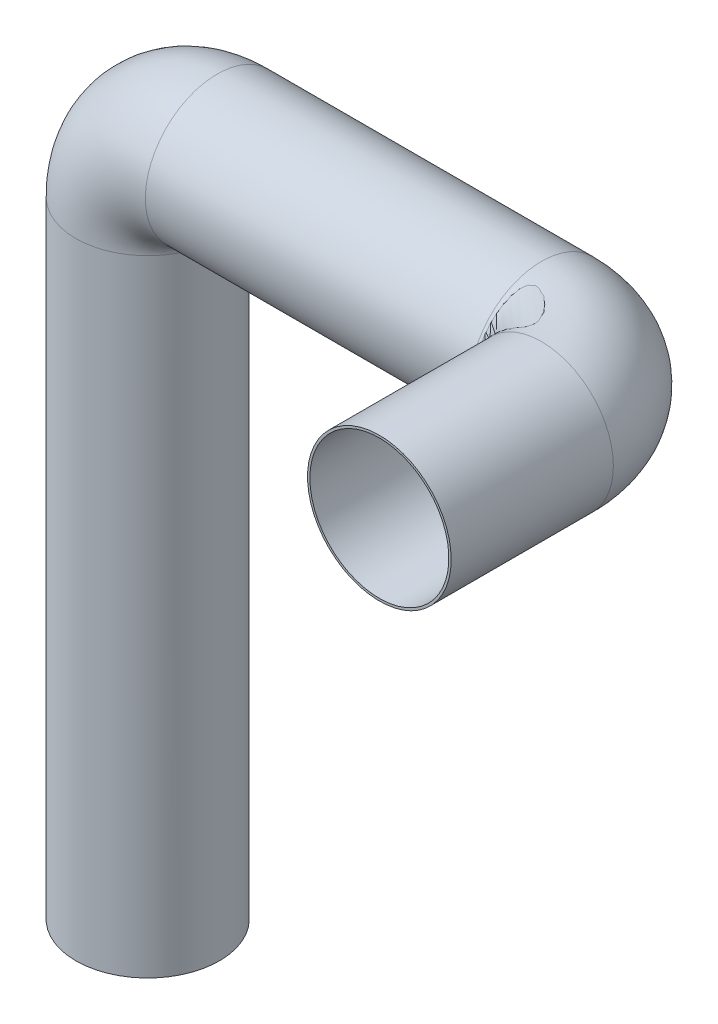
ISO-10303-21;
HEADER;
FILE_DESCRIPTION(('STEP AP214'),'2;1');
FILE_NAME('part.step','',(''),(''),'','','');
FILE_SCHEMA(('AUTOMOTIVE_DESIGN { 1 0 10303 214 1 1 1 1 }'));
ENDSEC;
DATA;
#1=APPLICATION_CONTEXT('core data for automotive mechanical design processes');
#2=APPLICATION_PROTOCOL_DEFINITION('international standard','automotive_design',2000,#1);
#3=PRODUCT_CONTEXT('',#1,'mechanical');
#4=PRODUCT('Part','Part','',(#3));
#5=PRODUCT_RELATED_PRODUCT_CATEGORY('part','',(#4));
#6=PRODUCT_DEFINITION_FORMATION('','',#4);
#7=PRODUCT_DEFINITION_CONTEXT('part definition',#1,'design');
#8=PRODUCT_DEFINITION('design','',#6,#7);
#9=PRODUCT_DEFINITION_SHAPE('','',#8);
#10=(LENGTH_UNIT() NAMED_UNIT(*) SI_UNIT(.MILLI.,.METRE.));
#11=(NAMED_UNIT(*) PLANE_ANGLE_UNIT() SI_UNIT($,.RADIAN.));
#12=(NAMED_UNIT(*) SI_UNIT($,.STERADIAN.) SOLID_ANGLE_UNIT());
#13=UNCERTAINTY_MEASURE_WITH_UNIT(LENGTH_MEASURE(1.E-05),#10,'distance_accuracy_value','');
#14=(GEOMETRIC_REPRESENTATION_CONTEXT(3) GLOBAL_UNCERTAINTY_ASSIGNED_CONTEXT((#13)) GLOBAL_UNIT_ASSIGNED_CONTEXT((#10,
#11,#12)) REPRESENTATION_CONTEXT('',''));
#15=CARTESIAN_POINT('',(0.,0.,0.));
#16=DIRECTION('',(0.,0.,1.));
#17=DIRECTION('',(1.,0.,0.));
#18=AXIS2_PLACEMENT_3D('',#15,#16,#17);
#19=CARTESIAN_POINT('',(0.,0.,0.));
#20=DIRECTION('',(0.,1.,0.));
#21=DIRECTION('',(0.,0.,1.));
#22=AXIS2_PLACEMENT_3D('',#19,#20,#21);
#23=CYLINDRICAL_SURFACE('',#22,31.);
#24=CARTESIAN_POINT('',(0.,0.,0.));
#25=DIRECTION('',(0.,1.,0.));
#26=DIRECTION('',(0.,0.,1.));
#27=AXIS2_PLACEMENT_3D('',#24,#25,#26);
#28=CIRCLE('',#27,31.);
#29=CARTESIAN_POINT('',(0.,0.,31.));
#30=VERTEX_POINT('',#29);
#31=EDGE_CURVE('E85',#30,#30,#28,.T.);
#32=ORIENTED_EDGE('',*,*,#31,.T.);
#33=EDGE_LOOP('',(#32));
#34=FACE_BOUND('',#33,.T.);
#35=CARTESIAN_POINT('',(0.,270.,0.));
#36=DIRECTION('',(0.,-1.,0.));
#37=DIRECTION('',(0.,0.,-1.));
#38=AXIS2_PLACEMENT_3D('',#35,#36,#37);
#39=CIRCLE('',#38,31.);
#40=CARTESIAN_POINT('',(30.,270.,-7.81024967590671));
#41=VERTEX_POINT('',#40);
#42=CARTESIAN_POINT('',(30.,270.,7.81024967590671));
#43=VERTEX_POINT('',#42);
#44=EDGE_CURVE('E86',#41,#43,#39,.F.);
#45=ORIENTED_EDGE('',*,*,#44,.F.);
#46=CARTESIAN_POINT('',(0.,300.,0.));
#47=DIRECTION('',(0.707106781186547,0.707106781186547,0.));
#48=DIRECTION('',(0.707106781186547,-0.707106781186547,0.));
#49=AXIS2_PLACEMENT_3D('',#46,#47,#48);
#50=ELLIPSE('',#49,43.8406204335659,31.);
#51=EDGE_CURVE('E11',#41,#43,#50,.F.);
#52=ORIENTED_EDGE('',*,*,#51,.T.);
#53=EDGE_LOOP('',(#45,#52));
#54=FACE_BOUND('',#53,.T.);
#55=ADVANCED_FACE('F37',(#34,#54),#23,.T.);
#56=CARTESIAN_POINT('',(30.,300.,0.));
#57=DIRECTION('',(1.,0.,0.));
#58=DIRECTION('',(0.,0.,-1.));
#59=AXIS2_PLACEMENT_3D('',#56,#57,#58);
#60=CYLINDRICAL_SURFACE('',#59,31.);
#61=CARTESIAN_POINT('',(170.,300.,0.));
#62=DIRECTION('',(-1.,0.,0.));
#63=DIRECTION('',(0.,0.,1.));
#64=AXIS2_PLACEMENT_3D('',#61,#62,#63);
#65=CIRCLE('',#64,31.);
#66=CARTESIAN_POINT('',(170.,292.189750324093,30.));
#67=VERTEX_POINT('',#66);
#68=CARTESIAN_POINT('',(170.,307.810249675907,30.));
#69=VERTEX_POINT('',#68);
#70=EDGE_CURVE('E91',#67,#69,#65,.F.);
#71=ORIENTED_EDGE('',*,*,#70,.F.);
#72=CARTESIAN_POINT('',(200.,300.,0.));
#73=DIRECTION('',(0.707106781186547,0.,0.707106781186547));
#74=DIRECTION('',(-0.707106781186547,0.,0.707106781186547));
#75=AXIS2_PLACEMENT_3D('',#72,#73,#74);
#76=ELLIPSE('',#75,43.8406204335659,31.);
#77=EDGE_CURVE('E45',#67,#69,#76,.F.);
#78=ORIENTED_EDGE('',*,*,#77,.T.);
#79=EDGE_LOOP('',(#71,#78));
#80=FACE_BOUND('',#79,.T.);
#81=ORIENTED_EDGE('',*,*,#51,.F.);
#82=CARTESIAN_POINT('',(30.,300.,0.));
#83=DIRECTION('',(1.,0.,0.));
#84=DIRECTION('',(0.,0.,-1.));
#85=AXIS2_PLACEMENT_3D('',#82,#83,#84);
#86=CIRCLE('',#85,31.);
#87=EDGE_CURVE('E89',#41,#43,#86,.T.);
#88=ORIENTED_EDGE('',*,*,#87,.T.);
#89=EDGE_LOOP('',(#81,#88));
#90=FACE_BOUND('',#89,.T.);
#91=ADVANCED_FACE('F107',(#80,#90),#60,.T.);
#92=CARTESIAN_POINT('',(200.,300.,30.));
#93=DIRECTION('',(0.,0.,1.));
#94=DIRECTION('',(1.,0.,0.));
#95=AXIS2_PLACEMENT_3D('',#92,#93,#94);
#96=CYLINDRICAL_SURFACE('',#95,31.);
#97=CARTESIAN_POINT('',(200.,300.,100.));
#98=DIRECTION('',(0.,0.,1.));
#99=DIRECTION('',(1.,0.,0.));
#100=AXIS2_PLACEMENT_3D('',#97,#98,#99);
#101=CIRCLE('',#100,31.);
#102=CARTESIAN_POINT('',(231.,300.,100.));
#103=VERTEX_POINT('',#102);
#104=EDGE_CURVE('E96',#103,#103,#101,.T.);
#105=ORIENTED_EDGE('',*,*,#104,.F.);
#106=EDGE_LOOP('',(#105));
#107=FACE_BOUND('',#106,.T.);
#108=ORIENTED_EDGE('',*,*,#77,.F.);
#109=CARTESIAN_POINT('',(200.,300.,30.));
#110=DIRECTION('',(0.,0.,1.));
#111=DIRECTION('',(1.,0.,0.));
#112=AXIS2_PLACEMENT_3D('',#109,#110,#111);
#113=CIRCLE('',#112,31.);
#114=EDGE_CURVE('E94',#67,#69,#113,.T.);
#115=ORIENTED_EDGE('',*,*,#114,.T.);
#116=EDGE_LOOP('',(#108,#115));
#117=FACE_BOUND('',#116,.T.);
#118=ADVANCED_FACE('F39',(#107,#117),#96,.T.);
#119=CARTESIAN_POINT('',(0.,0.,0.));
#120=DIRECTION('',(0.,1.,0.));
#121=DIRECTION('',(0.,0.,1.));
#122=AXIS2_PLACEMENT_3D('',#119,#120,#121);
#123=PLANE('',#122);
#124=CARTESIAN_POINT('',(0.,0.,0.));
#125=DIRECTION('',(0.,1.,0.));
#126=DIRECTION('',(0.,0.,1.));
#127=AXIS2_PLACEMENT_3D('',#124,#125,#126);
#128=CIRCLE('',#127,30.);
#129=CARTESIAN_POINT('',(0.,0.,30.));
#130=VERTEX_POINT('',#129);
#131=EDGE_CURVE('E154',#130,#130,#128,.T.);
#132=ORIENTED_EDGE('',*,*,#131,.T.);
#133=EDGE_LOOP('',(#132));
#134=FACE_BOUND('',#133,.T.);
#135=ORIENTED_EDGE('',*,*,#31,.F.);
#136=EDGE_LOOP('',(#135));
#137=FACE_BOUND('',#136,.T.);
#138=ADVANCED_FACE('F106',(#134,#137),#123,.F.);
#139=CARTESIAN_POINT('',(200.,300.,100.));
#140=DIRECTION('',(0.,0.,1.));
#141=DIRECTION('',(-1.,0.,0.));
#142=AXIS2_PLACEMENT_3D('',#139,#140,#141);
#143=PLANE('',#142);
#144=CARTESIAN_POINT('',(200.,300.,100.));
#145=DIRECTION('',(0.,0.,1.));
#146=DIRECTION('',(-1.,0.,0.));
#147=AXIS2_PLACEMENT_3D('',#144,#145,#146);
#148=CIRCLE('',#147,30.);
#149=CARTESIAN_POINT('',(170.,300.,100.));
#150=VERTEX_POINT('',#149);
#151=EDGE_CURVE('E76',#150,#150,#148,.T.);
#152=ORIENTED_EDGE('',*,*,#151,.F.);
#153=EDGE_LOOP('',(#152));
#154=FACE_BOUND('',#153,.T.);
#155=ORIENTED_EDGE('',*,*,#104,.T.);
#156=EDGE_LOOP('',(#155));
#157=FACE_BOUND('',#156,.T.);
#158=ADVANCED_FACE('F102',(#154,#157),#143,.T.);
#159=CARTESIAN_POINT('',(0.,270.,0.));
#160=DIRECTION('',(0.,-1.,0.));
#161=DIRECTION('',(-1.,0.,0.));
#162=AXIS2_PLACEMENT_3D('',#159,#160,#161);
#163=CIRCLE('',#162,31.);
#164=TRIMMED_CURVE('',#163,(PARAMETER_VALUE(-2.88690459932043)),
(PARAMETER_VALUE(2.88690459932043)),.T.,.PARAMETER.);
#165=CARTESIAN_POINT('',(30.,270.,0.));
#166=DIRECTION('',(0.,0.,-1.));
#167=AXIS1_PLACEMENT('',#165,#166);
#168=SURFACE_OF_REVOLUTION('',#164,#167);
#169=ORIENTED_EDGE('',*,*,#87,.F.);
#170=ORIENTED_EDGE('',*,*,#44,.T.);
#171=EDGE_LOOP('',(#169,#170));
#172=FACE_BOUND('',#171,.T.);
#173=ADVANCED_FACE('F114',(#172),#168,.T.);
#174=CARTESIAN_POINT('',(170.,300.,0.));
#175=DIRECTION('',(-1.,0.,0.));
#176=DIRECTION('',(0.,0.,-1.));
#177=AXIS2_PLACEMENT_3D('',#174,#175,#176);
#178=CIRCLE('',#177,31.);
#179=TRIMMED_CURVE('',#178,(PARAMETER_VALUE(-2.88690459932043)),
(PARAMETER_VALUE(2.88690459932043)),.T.,.PARAMETER.);
#180=CARTESIAN_POINT('',(170.,300.,30.));
#181=DIRECTION('',(0.,-1.,0.));
#182=AXIS1_PLACEMENT('',#180,#181);
#183=SURFACE_OF_REVOLUTION('',#179,#182);
#184=ORIENTED_EDGE('',*,*,#114,.F.);
#185=ORIENTED_EDGE('',*,*,#70,.T.);
#186=EDGE_LOOP('',(#184,#185));
#187=FACE_BOUND('',#186,.T.);
#188=ADVANCED_FACE('F108',(#187),#183,.T.);
#189=CARTESIAN_POINT('',(0.,0.,0.));
#190=DIRECTION('',(0.,1.,0.));
#191=DIRECTION('',(0.,0.,1.));
#192=AXIS2_PLACEMENT_3D('',#189,#190,#191);
#193=CYLINDRICAL_SURFACE('',#192,30.);
#194=CARTESIAN_POINT('',(0.,270.,0.));
#195=DIRECTION('',(0.,1.,0.));
#196=DIRECTION('',(0.,0.,1.));
#197=AXIS2_PLACEMENT_3D('',#194,#195,#196);
#198=CIRCLE('',#197,30.);
#199=CARTESIAN_POINT('',(30.,270.,0.));
#200=VERTEX_POINT('',#199);
#201=EDGE_CURVE('E79',#200,#200,#198,.T.);
#202=ORIENTED_EDGE('',*,*,#201,.T.);
#203=EDGE_LOOP('',(#202));
#204=FACE_BOUND('',#203,.T.);
#205=ORIENTED_EDGE('',*,*,#131,.F.);
#206=EDGE_LOOP('',(#205));
#207=FACE_BOUND('',#206,.T.);
#208=ADVANCED_FACE('F113',(#204,#207),#193,.F.);
#209=CARTESIAN_POINT('',(0.,270.,0.));
#210=DIRECTION('',(0.,-1.,0.));
#211=DIRECTION('',(-1.,0.,0.));
#212=AXIS2_PLACEMENT_3D('',#209,#210,#211);
#213=CIRCLE('',#212,30.);
#214=TRIMMED_CURVE('',#213,(PARAMETER_VALUE(-3.14159262378747)),
(PARAMETER_VALUE(3.14159262378747)),.T.,.PARAMETER.);
#215=CARTESIAN_POINT('',(30.,270.,0.));
#216=DIRECTION('',(0.,0.,-1.));
#217=AXIS1_PLACEMENT('',#215,#216);
#218=SURFACE_OF_REVOLUTION('',#214,#217);
#219=CARTESIAN_POINT('',(30.,300.,0.));
#220=DIRECTION('',(1.,0.,0.));
#221=DIRECTION('',(0.,0.,1.));
#222=AXIS2_PLACEMENT_3D('',#219,#220,#221);
#223=CIRCLE('',#222,30.);
#224=EDGE_CURVE('E74',#200,#200,#223,.T.);
#225=ORIENTED_EDGE('',*,*,#224,.T.);
#226=ORIENTED_EDGE('',*,*,#201,.F.);
#227=EDGE_LOOP('',(#225,#226));
#228=FACE_BOUND('',#227,.T.);
#229=ADVANCED_FACE('F119',(#228),#218,.F.);
#230=CARTESIAN_POINT('',(30.,300.,0.));
#231=DIRECTION('',(1.,0.,0.));
#232=DIRECTION('',(0.,0.,-1.));
#233=AXIS2_PLACEMENT_3D('',#230,#231,#232);
#234=CYLINDRICAL_SURFACE('',#233,30.);
#235=CARTESIAN_POINT('',(170.,300.,0.));
#236=DIRECTION('',(1.,0.,0.));
#237=DIRECTION('',(0.,0.,1.));
#238=AXIS2_PLACEMENT_3D('',#235,#236,#237);
#239=CIRCLE('',#238,30.);
#240=CARTESIAN_POINT('',(170.,300.,30.));
#241=VERTEX_POINT('',#240);
#242=EDGE_CURVE('E69',#241,#241,#239,.T.);
#243=ORIENTED_EDGE('',*,*,#242,.T.);
#244=EDGE_LOOP('',(#243));
#245=FACE_BOUND('',#244,.T.);
#246=ORIENTED_EDGE('',*,*,#224,.F.);
#247=EDGE_LOOP('',(#246));
#248=FACE_BOUND('',#247,.T.);
#249=ADVANCED_FACE('F144',(#245,#248),#234,.F.);
#250=CARTESIAN_POINT('',(170.,300.,30.));
#251=DIRECTION('',(0.,-1.,0.));
#252=DIRECTION('',(0.,0.,-1.));
#253=AXIS2_PLACEMENT_3D('',#250,#251,#252);
#254=DEGENERATE_TOROIDAL_SURFACE('',#253,30.,30.,.T.);
#255=CARTESIAN_POINT('',(200.,300.,30.));
#256=DIRECTION('',(0.,0.,1.));
#257=DIRECTION('',(-1.,0.,0.));
#258=AXIS2_PLACEMENT_3D('',#255,#256,#257);
#259=CIRCLE('',#258,30.);
#260=EDGE_CURVE('E72',#241,#241,#259,.T.);
#261=ORIENTED_EDGE('',*,*,#260,.T.);
#262=ORIENTED_EDGE('',*,*,#242,.F.);
#263=EDGE_LOOP('',(#261,#262));
#264=FACE_BOUND('',#263,.T.);
#265=ADVANCED_FACE('F70',(#264),#254,.F.);
#266=CARTESIAN_POINT('',(200.,300.,30.));
#267=DIRECTION('',(0.,0.,1.));
#268=DIRECTION('',(1.,0.,0.));
#269=AXIS2_PLACEMENT_3D('',#266,#267,#268);
#270=CYLINDRICAL_SURFACE('',#269,30.);
#271=ORIENTED_EDGE('',*,*,#151,.T.);
#272=EDGE_LOOP('',(#271));
#273=FACE_BOUND('',#272,.T.);
#274=ORIENTED_EDGE('',*,*,#260,.F.);
#275=EDGE_LOOP('',(#274));
#276=FACE_BOUND('',#275,.T.);
#277=ADVANCED_FACE('F135',(#273,#276),#270,.F.);
#278=CLOSED_SHELL('',(#55,#91,#118,#138,#158,#173,#188,#208,#229,#249,#265,#277));
#279=MANIFOLD_SOLID_BREP('B2',#278);
#280=ADVANCED_BREP_SHAPE_REPRESENTATION('',(#18,#279),#14);
#281=SHAPE_DEFINITION_REPRESENTATION(#9,#280);
ENDSEC;
END-ISO-10303-21;
